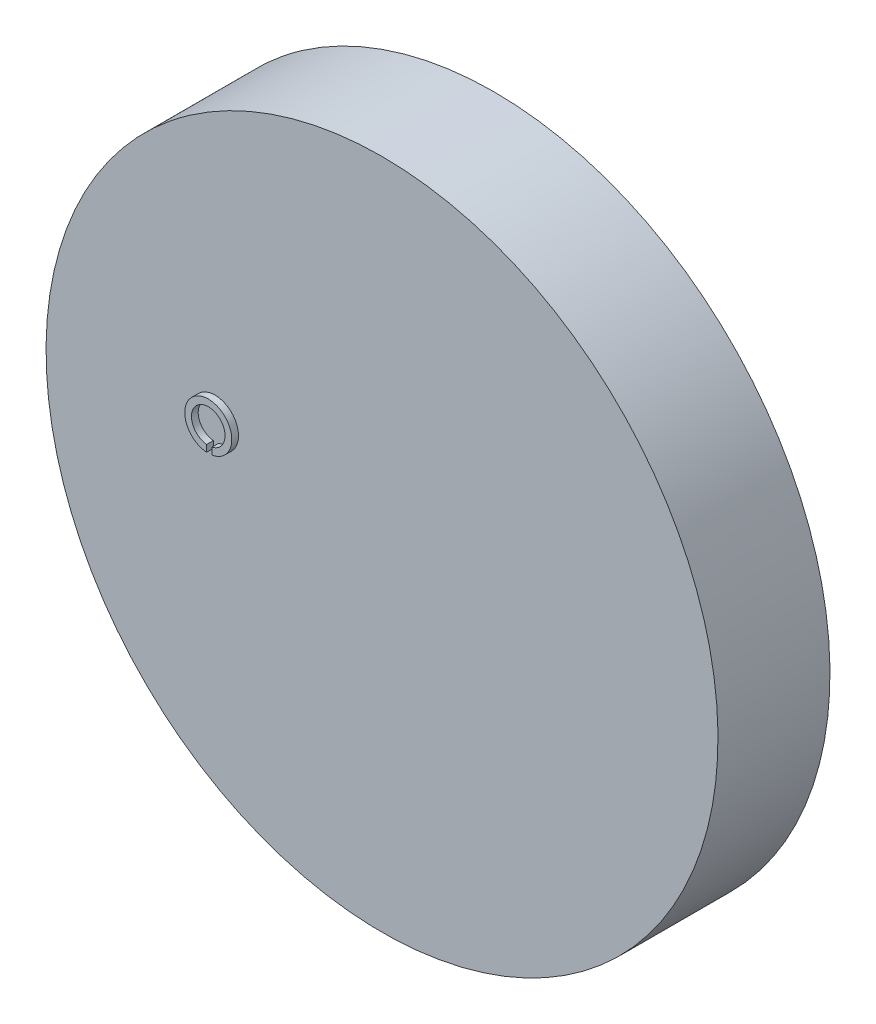
ISO-10303-21;
HEADER;
FILE_DESCRIPTION(('STEP AP214'),'2;1');
FILE_NAME('part.step','',(''),(''),'','','');
FILE_SCHEMA(('AUTOMOTIVE_DESIGN { 1 0 10303 214 1 1 1 1 }'));
ENDSEC;
DATA;
#1=APPLICATION_CONTEXT('core data for automotive mechanical design processes');
#2=APPLICATION_PROTOCOL_DEFINITION('international standard','automotive_design',2000,#1);
#3=PRODUCT_CONTEXT('',#1,'mechanical');
#4=PRODUCT('Part','Part','',(#3));
#5=PRODUCT_RELATED_PRODUCT_CATEGORY('part','',(#4));
#6=PRODUCT_DEFINITION_FORMATION('','',#4);
#7=PRODUCT_DEFINITION_CONTEXT('part definition',#1,'design');
#8=PRODUCT_DEFINITION('design','',#6,#7);
#9=PRODUCT_DEFINITION_SHAPE('','',#8);
#10=(LENGTH_UNIT() NAMED_UNIT(*) SI_UNIT(.MILLI.,.METRE.));
#11=(NAMED_UNIT(*) PLANE_ANGLE_UNIT() SI_UNIT($,.RADIAN.));
#12=(NAMED_UNIT(*) SI_UNIT($,.STERADIAN.) SOLID_ANGLE_UNIT());
#13=UNCERTAINTY_MEASURE_WITH_UNIT(LENGTH_MEASURE(1.E-05),#10,'distance_accuracy_value','');
#14=(GEOMETRIC_REPRESENTATION_CONTEXT(3) GLOBAL_UNCERTAINTY_ASSIGNED_CONTEXT((#13)) GLOBAL_UNIT_ASSIGNED_CONTEXT((#10,
#11,#12)) REPRESENTATION_CONTEXT('',''));
#15=CARTESIAN_POINT('',(0.,0.,0.));
#16=DIRECTION('',(0.,0.,1.));
#17=DIRECTION('',(1.,0.,0.));
#18=AXIS2_PLACEMENT_3D('',#15,#16,#17);
#19=CARTESIAN_POINT('',(-14.914552594797,1.98735562858988,10.));
#20=DIRECTION('',(0.,0.,1.));
#21=DIRECTION('',(1.,0.,0.));
#22=AXIS2_PLACEMENT_3D('',#19,#20,#21);
#23=CYLINDRICAL_SURFACE('',#22,2.1);
#24=DIRECTION('',(0.,0.,1.));
#25=VECTOR('',#24,1.);
#26=CARTESIAN_POINT('',(-15.064552594797,-0.107280377975458,10.));
#27=LINE('',#26,#25);
#28=CARTESIAN_POINT('',(-15.064552594797,-0.107280377975458,10.6));
#29=VERTEX_POINT('',#28);
#30=CARTESIAN_POINT('',(-15.064552594797,-0.107280377975458,10.));
#31=VERTEX_POINT('',#30);
#32=EDGE_CURVE('E91',#29,#31,#27,.F.);
#33=ORIENTED_EDGE('',*,*,#32,.F.);
#34=CARTESIAN_POINT('',(-14.914552594797,1.98735562858988,10.6));
#35=DIRECTION('',(0.,0.,1.));
#36=DIRECTION('',(1.,0.,0.));
#37=AXIS2_PLACEMENT_3D('',#34,#35,#36);
#38=CIRCLE('',#37,2.1);
#39=CARTESIAN_POINT('',(-14.584552594797,-0.086553723334641,10.6));
#40=VERTEX_POINT('',#39);
#41=EDGE_CURVE('E101',#40,#29,#38,.T.);
#42=ORIENTED_EDGE('',*,*,#41,.F.);
#43=DIRECTION('',(0.,0.,1.));
#44=VECTOR('',#43,1.);
#45=CARTESIAN_POINT('',(-14.584552594797,-0.086553723334641,10.));
#46=LINE('',#45,#44);
#47=CARTESIAN_POINT('',(-14.584552594797,-0.086553723334641,10.));
#48=VERTEX_POINT('',#47);
#49=EDGE_CURVE('E105',#48,#40,#46,.T.);
#50=ORIENTED_EDGE('',*,*,#49,.F.);
#51=CARTESIAN_POINT('',(-14.914552594797,1.98735562858988,10.));
#52=DIRECTION('',(0.,0.,1.));
#53=DIRECTION('',(1.,0.,0.));
#54=AXIS2_PLACEMENT_3D('',#51,#52,#53);
#55=CIRCLE('',#54,2.1);
#56=EDGE_CURVE('E103',#48,#31,#55,.T.);
#57=ORIENTED_EDGE('',*,*,#56,.T.);
#58=EDGE_LOOP('',(#33,#42,#50,#57));
#59=FACE_BOUND('',#58,.T.);
#60=ADVANCED_FACE('F51',(#59),#23,.T.);
#61=CARTESIAN_POINT('',(-14.914552594797,1.98735562858988,10.));
#62=DIRECTION('',(0.,0.,1.));
#63=DIRECTION('',(1.,0.,0.));
#64=AXIS2_PLACEMENT_3D('',#61,#62,#63);
#65=PLANE('',#64);
#66=CARTESIAN_POINT('',(-14.914552594797,1.98735562858988,10.));
#67=DIRECTION('',(0.,0.,1.));
#68=DIRECTION('',(1.,0.,0.));
#69=AXIS2_PLACEMENT_3D('',#66,#67,#68);
#70=CIRCLE('',#69,1.5);
#71=CARTESIAN_POINT('',(-14.584552594797,0.524105820799019,10.));
#72=VERTEX_POINT('',#71);
#73=CARTESIAN_POINT('',(-15.064552594797,0.494874472929953,10.));
#74=VERTEX_POINT('',#73);
#75=EDGE_CURVE('E108',#72,#74,#70,.T.);
#76=ORIENTED_EDGE('',*,*,#75,.T.);
#77=DIRECTION('',(0.,1.,0.));
#78=VECTOR('',#77,1.);
#79=CARTESIAN_POINT('',(-15.064552594797,-0.112644371410116,10.));
#80=LINE('',#79,#78);
#81=EDGE_CURVE('E73',#31,#74,#80,.T.);
#82=ORIENTED_EDGE('',*,*,#81,.F.);
#83=ORIENTED_EDGE('',*,*,#56,.F.);
#84=DIRECTION('',(0.,1.,0.));
#85=VECTOR('',#84,1.);
#86=CARTESIAN_POINT('',(-14.584552594797,-0.112644371410116,10.));
#87=LINE('',#86,#85);
#88=EDGE_CURVE('E121',#48,#72,#87,.T.);
#89=ORIENTED_EDGE('',*,*,#88,.T.);
#90=EDGE_LOOP('',(#76,#82,#83,#89));
#91=FACE_BOUND('',#90,.T.);
#92=ADVANCED_FACE('F124',(#91),#65,.F.);
#93=CARTESIAN_POINT('',(-14.914552594797,1.98735562858988,10.6));
#94=DIRECTION('',(0.,0.,1.));
#95=DIRECTION('',(1.,0.,0.));
#96=AXIS2_PLACEMENT_3D('',#93,#94,#95);
#97=PLANE('',#96);
#98=DIRECTION('',(0.,1.,0.));
#99=VECTOR('',#98,1.);
#100=CARTESIAN_POINT('',(-15.064552594797,-0.112644371410116,10.6));
#101=LINE('',#100,#99);
#102=CARTESIAN_POINT('',(-15.064552594797,0.494874472929953,10.6));
#103=VERTEX_POINT('',#102);
#104=EDGE_CURVE('E88',#29,#103,#101,.T.);
#105=ORIENTED_EDGE('',*,*,#104,.T.);
#106=CARTESIAN_POINT('',(-14.914552594797,1.98735562858988,10.6));
#107=DIRECTION('',(0.,0.,1.));
#108=DIRECTION('',(1.,0.,0.));
#109=AXIS2_PLACEMENT_3D('',#106,#107,#108);
#110=CIRCLE('',#109,1.5);
#111=CARTESIAN_POINT('',(-14.584552594797,0.524105820799019,10.6));
#112=VERTEX_POINT('',#111);
#113=EDGE_CURVE('E104',#112,#103,#110,.T.);
#114=ORIENTED_EDGE('',*,*,#113,.F.);
#115=DIRECTION('',(0.,1.,0.));
#116=VECTOR('',#115,1.);
#117=CARTESIAN_POINT('',(-14.584552594797,-0.112644371410116,10.6));
#118=LINE('',#117,#116);
#119=EDGE_CURVE('E65',#40,#112,#118,.T.);
#120=ORIENTED_EDGE('',*,*,#119,.F.);
#121=ORIENTED_EDGE('',*,*,#41,.T.);
#122=EDGE_LOOP('',(#105,#114,#120,#121));
#123=FACE_BOUND('',#122,.T.);
#124=ADVANCED_FACE('F107',(#123),#97,.T.);
#125=CARTESIAN_POINT('',(-14.914552594797,1.98735562858988,10.));
#126=DIRECTION('',(0.,0.,1.));
#127=DIRECTION('',(1.,0.,0.));
#128=AXIS2_PLACEMENT_3D('',#125,#126,#127);
#129=CYLINDRICAL_SURFACE('',#128,1.5);
#130=ORIENTED_EDGE('',*,*,#113,.T.);
#131=DIRECTION('',(0.,0.,1.));
#132=VECTOR('',#131,1.);
#133=CARTESIAN_POINT('',(-15.064552594797,0.494874472929953,10.));
#134=LINE('',#133,#132);
#135=EDGE_CURVE('E12',#103,#74,#134,.F.);
#136=ORIENTED_EDGE('',*,*,#135,.T.);
#137=ORIENTED_EDGE('',*,*,#75,.F.);
#138=DIRECTION('',(0.,0.,1.));
#139=VECTOR('',#138,1.);
#140=CARTESIAN_POINT('',(-14.584552594797,0.524105820799019,10.));
#141=LINE('',#140,#139);
#142=EDGE_CURVE('E58',#72,#112,#141,.T.);
#143=ORIENTED_EDGE('',*,*,#142,.T.);
#144=EDGE_LOOP('',(#130,#136,#137,#143));
#145=FACE_BOUND('',#144,.T.);
#146=ADVANCED_FACE('F116',(#145),#129,.F.);
#147=CARTESIAN_POINT('',(-14.584552594797,-0.112644371410116,10.6));
#148=DIRECTION('',(1.,0.,0.));
#149=DIRECTION('',(0.,0.,-1.));
#150=AXIS2_PLACEMENT_3D('',#147,#148,#149);
#151=PLANE('',#150);
#152=ORIENTED_EDGE('',*,*,#49,.T.);
#153=ORIENTED_EDGE('',*,*,#119,.T.);
#154=ORIENTED_EDGE('',*,*,#142,.F.);
#155=ORIENTED_EDGE('',*,*,#88,.F.);
#156=EDGE_LOOP('',(#152,#153,#154,#155));
#157=FACE_BOUND('',#156,.T.);
#158=ADVANCED_FACE('F125',(#157),#151,.F.);
#159=CARTESIAN_POINT('',(-15.064552594797,-0.112644371410116,10.6));
#160=DIRECTION('',(-1.,0.,0.));
#161=DIRECTION('',(0.,0.,1.));
#162=AXIS2_PLACEMENT_3D('',#159,#160,#161);
#163=PLANE('',#162);
#164=ORIENTED_EDGE('',*,*,#32,.T.);
#165=ORIENTED_EDGE('',*,*,#81,.T.);
#166=ORIENTED_EDGE('',*,*,#135,.F.);
#167=ORIENTED_EDGE('',*,*,#104,.F.);
#168=EDGE_LOOP('',(#164,#165,#166,#167));
#169=FACE_BOUND('',#168,.T.);
#170=ADVANCED_FACE('F90',(#169),#163,.F.);
#171=CLOSED_SHELL('',(#60,#92,#124,#146,#158,#170));
#172=MANIFOLD_SOLID_BREP('B2',#171);
#173=CARTESIAN_POINT('',(0.,0.,10.));
#174=DIRECTION('',(0.,0.,1.));
#175=DIRECTION('',(-0.627880281947034,0.778309932830176,0.));
#176=AXIS2_PLACEMENT_3D('',#173,#174,#175);
#177=ELLIPSE('',#176,30.,30.);
#178=DIRECTION('',(0.,0.,-1.));
#179=VECTOR('',#178,1.);
#180=SURFACE_OF_LINEAR_EXTRUSION('',#177,#179);
#181=CARTESIAN_POINT('',(-18.836408458411,23.3492979849053,10.));
#182=VERTEX_POINT('',#181);
#183=EDGE_CURVE('E50',#182,#182,#177,.T.);
#184=ORIENTED_EDGE('',*,*,#183,.F.);
#185=EDGE_LOOP('',(#184));
#186=FACE_BOUND('',#185,.T.);
#187=CARTESIAN_POINT('',(0.,0.,0.));
#188=DIRECTION('',(0.,0.,1.));
#189=DIRECTION('',(-0.627880281947034,0.778309932830176,0.));
#190=AXIS2_PLACEMENT_3D('',#187,#188,#189);
#191=ELLIPSE('',#190,30.,30.);
#192=CARTESIAN_POINT('',(-18.836408458411,23.3492979849053,0.));
#193=VERTEX_POINT('',#192);
#194=EDGE_CURVE('E178',#193,#193,#191,.T.);
#195=ORIENTED_EDGE('',*,*,#194,.T.);
#196=EDGE_LOOP('',(#195));
#197=FACE_BOUND('',#196,.T.);
#198=ADVANCED_FACE('F174',(#186,#197),#180,.F.);
#199=CARTESIAN_POINT('',(0.,0.,10.));
#200=DIRECTION('',(0.,0.,1.));
#201=DIRECTION('',(1.,0.,0.));
#202=AXIS2_PLACEMENT_3D('',#199,#200,#201);
#203=PLANE('',#202);
#204=ORIENTED_EDGE('',*,*,#183,.T.);
#205=EDGE_LOOP('',(#204));
#206=FACE_BOUND('',#205,.T.);
#207=ADVANCED_FACE('F190',(#206),#203,.T.);
#208=CARTESIAN_POINT('',(0.,0.,0.));
#209=DIRECTION('',(0.,0.,1.));
#210=DIRECTION('',(1.,0.,0.));
#211=AXIS2_PLACEMENT_3D('',#208,#209,#210);
#212=PLANE('',#211);
#213=ORIENTED_EDGE('',*,*,#194,.F.);
#214=EDGE_LOOP('',(#213));
#215=FACE_BOUND('',#214,.T.);
#216=ADVANCED_FACE('F188',(#215),#212,.F.);
#217=CLOSED_SHELL('',(#198,#207,#216));
#218=MANIFOLD_SOLID_BREP('B6',#217);
#219=ADVANCED_BREP_SHAPE_REPRESENTATION('',(#18,#172,#218),#14);
#220=SHAPE_DEFINITION_REPRESENTATION(#9,#219);
ENDSEC;
END-ISO-10303-21;
